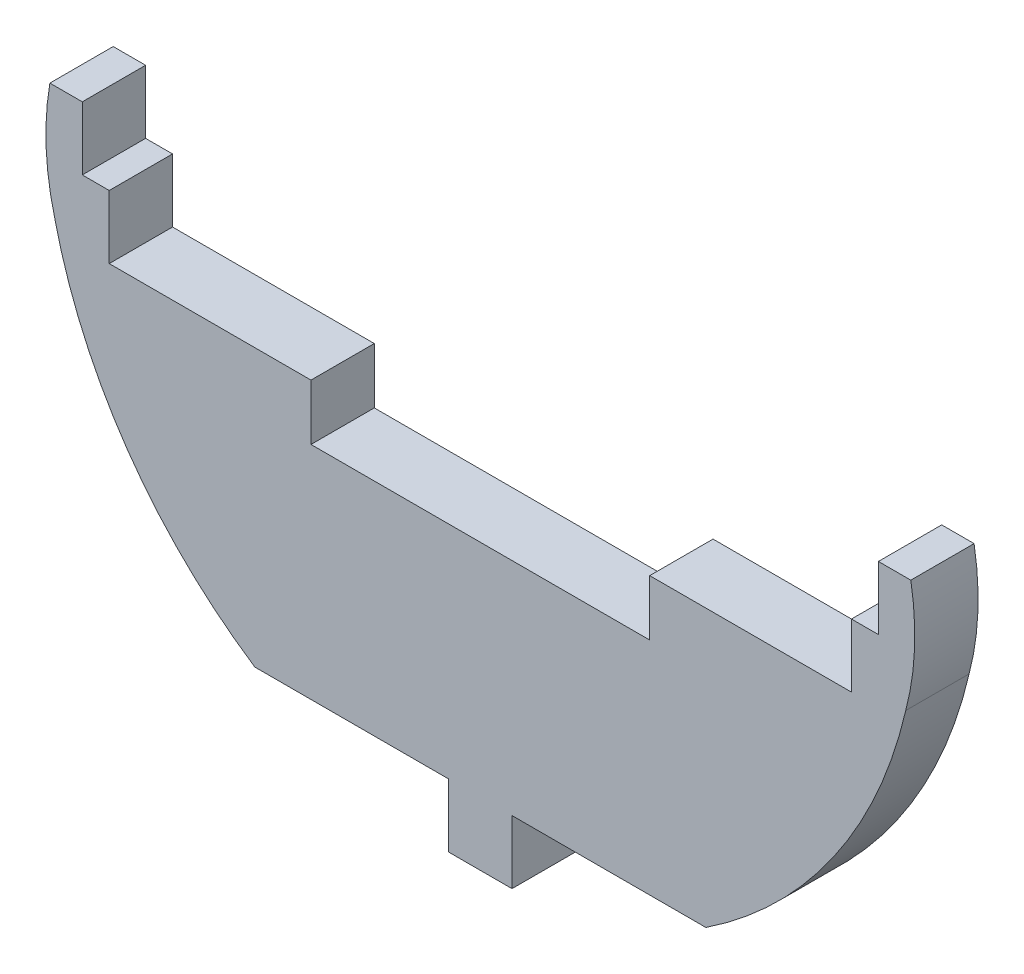
ISO-10303-21;
HEADER;
FILE_DESCRIPTION(('STEP AP214'),'2;1');
FILE_NAME('part.step','',(''),(''),'','','');
FILE_SCHEMA(('AUTOMOTIVE_DESIGN { 1 0 10303 214 1 1 1 1 }'));
ENDSEC;
DATA;
#1=APPLICATION_CONTEXT('core data for automotive mechanical design processes');
#2=APPLICATION_PROTOCOL_DEFINITION('international standard','automotive_design',2000,#1);
#3=PRODUCT_CONTEXT('',#1,'mechanical');
#4=PRODUCT('Part','Part','',(#3));
#5=PRODUCT_RELATED_PRODUCT_CATEGORY('part','',(#4));
#6=PRODUCT_DEFINITION_FORMATION('','',#4);
#7=PRODUCT_DEFINITION_CONTEXT('part definition',#1,'design');
#8=PRODUCT_DEFINITION('design','',#6,#7);
#9=PRODUCT_DEFINITION_SHAPE('','',#8);
#10=(LENGTH_UNIT() NAMED_UNIT(*) SI_UNIT(.MILLI.,.METRE.));
#11=(NAMED_UNIT(*) PLANE_ANGLE_UNIT() SI_UNIT($,.RADIAN.));
#12=(NAMED_UNIT(*) SI_UNIT($,.STERADIAN.) SOLID_ANGLE_UNIT());
#13=UNCERTAINTY_MEASURE_WITH_UNIT(LENGTH_MEASURE(1.E-05),#10,'distance_accuracy_value','');
#14=(GEOMETRIC_REPRESENTATION_CONTEXT(3) GLOBAL_UNCERTAINTY_ASSIGNED_CONTEXT((#13)) GLOBAL_UNIT_ASSIGNED_CONTEXT((#10,
#11,#12)) REPRESENTATION_CONTEXT('',''));
#15=CARTESIAN_POINT('',(0.,0.,0.));
#16=DIRECTION('',(0.,0.,1.));
#17=DIRECTION('',(1.,0.,0.));
#18=AXIS2_PLACEMENT_3D('',#15,#16,#17);
#19=CARTESIAN_POINT('',(7.81536532569599,19.9182786013469,3.));
#20=DIRECTION('',(0.,0.,-1.));
#21=DIRECTION('',(-1.,0.,0.));
#22=AXIS2_PLACEMENT_3D('',#19,#20,#21);
#23=CYLINDRICAL_SURFACE('',#22,12.768);
#24=CARTESIAN_POINT('',(7.81536532569599,19.9182786013469,0.));
#25=DIRECTION('',(0.,0.,1.));
#26=DIRECTION('',(1.,0.,0.));
#27=AXIS2_PLACEMENT_3D('',#24,#25,#26);
#28=CIRCLE('',#27,12.768);
#29=CARTESIAN_POINT('',(20.3945425277977,22.106,0.));
#30=VERTEX_POINT('',#29);
#31=CARTESIAN_POINT('',(20.154,16.635,0.));
#32=VERTEX_POINT('',#31);
#33=EDGE_CURVE('E212',#30,#32,#28,.F.);
#34=ORIENTED_EDGE('',*,*,#33,.F.);
#35=DIRECTION('',(0.,0.,-1.));
#36=VECTOR('',#35,1.);
#37=CARTESIAN_POINT('',(20.3945425277977,22.106,3.));
#38=LINE('',#37,#36);
#39=CARTESIAN_POINT('',(20.3945425277977,22.106,3.));
#40=VERTEX_POINT('',#39);
#41=EDGE_CURVE('E11',#40,#30,#38,.T.);
#42=ORIENTED_EDGE('',*,*,#41,.F.);
#43=CARTESIAN_POINT('',(7.81536532569599,19.9182786013469,3.));
#44=DIRECTION('',(0.,0.,1.));
#45=DIRECTION('',(1.,0.,0.));
#46=AXIS2_PLACEMENT_3D('',#43,#44,#45);
#47=CIRCLE('',#46,12.768);
#48=CARTESIAN_POINT('',(20.154,16.635,3.));
#49=VERTEX_POINT('',#48);
#50=EDGE_CURVE('E266',#40,#49,#47,.F.);
#51=ORIENTED_EDGE('',*,*,#50,.T.);
#52=DIRECTION('',(0.,0.,-1.));
#53=VECTOR('',#52,1.);
#54=CARTESIAN_POINT('',(20.154,16.635,3.));
#55=LINE('',#54,#53);
#56=EDGE_CURVE('E51',#49,#32,#55,.T.);
#57=ORIENTED_EDGE('',*,*,#56,.T.);
#58=EDGE_LOOP('',(#34,#42,#51,#57));
#59=FACE_BOUND('',#58,.T.);
#60=ADVANCED_FACE('F35',(#59),#23,.T.);
#61=CARTESIAN_POINT('',(0.,22.106,3.));
#62=DIRECTION('',(0.,1.,0.));
#63=DIRECTION('',(0.,0.,1.));
#64=AXIS2_PLACEMENT_3D('',#61,#62,#63);
#65=PLANE('',#64);
#66=DIRECTION('',(1.,0.,0.));
#67=VECTOR('',#66,1.);
#68=CARTESIAN_POINT('',(0.,22.106,0.));
#69=LINE('',#68,#67);
#70=CARTESIAN_POINT('',(18.859,22.106,0.));
#71=VERTEX_POINT('',#70);
#72=EDGE_CURVE('E214',#71,#30,#69,.T.);
#73=ORIENTED_EDGE('',*,*,#72,.F.);
#74=DIRECTION('',(0.,0.,-1.));
#75=VECTOR('',#74,1.);
#76=CARTESIAN_POINT('',(18.859,22.106,3.));
#77=LINE('',#76,#75);
#78=CARTESIAN_POINT('',(18.859,22.106,3.));
#79=VERTEX_POINT('',#78);
#80=EDGE_CURVE('E43',#79,#71,#77,.T.);
#81=ORIENTED_EDGE('',*,*,#80,.F.);
#82=DIRECTION('',(1.,0.,0.));
#83=VECTOR('',#82,1.);
#84=CARTESIAN_POINT('',(0.,22.106,3.));
#85=LINE('',#84,#83);
#86=EDGE_CURVE('E331',#79,#40,#85,.T.);
#87=ORIENTED_EDGE('',*,*,#86,.T.);
#88=ORIENTED_EDGE('',*,*,#41,.T.);
#89=EDGE_LOOP('',(#73,#81,#87,#88));
#90=FACE_BOUND('',#89,.T.);
#91=ADVANCED_FACE('F319',(#90),#65,.T.);
#92=CARTESIAN_POINT('',(18.859,0.,3.));
#93=DIRECTION('',(-1.,0.,0.));
#94=DIRECTION('',(0.,0.,1.));
#95=AXIS2_PLACEMENT_3D('',#92,#93,#94);
#96=PLANE('',#95);
#97=DIRECTION('',(0.,1.,0.));
#98=VECTOR('',#97,1.);
#99=CARTESIAN_POINT('',(18.859,0.,0.));
#100=LINE('',#99,#98);
#101=CARTESIAN_POINT('',(18.859,19.106,0.));
#102=VERTEX_POINT('',#101);
#103=EDGE_CURVE('E217',#102,#71,#100,.T.);
#104=ORIENTED_EDGE('',*,*,#103,.F.);
#105=DIRECTION('',(0.,0.,-1.));
#106=VECTOR('',#105,1.);
#107=CARTESIAN_POINT('',(18.859,19.106,3.));
#108=LINE('',#107,#106);
#109=CARTESIAN_POINT('',(18.859,19.106,3.));
#110=VERTEX_POINT('',#109);
#111=EDGE_CURVE('E308',#110,#102,#108,.T.);
#112=ORIENTED_EDGE('',*,*,#111,.F.);
#113=DIRECTION('',(0.,1.,0.));
#114=VECTOR('',#113,1.);
#115=CARTESIAN_POINT('',(18.859,0.,3.));
#116=LINE('',#115,#114);
#117=EDGE_CURVE('E315',#110,#79,#116,.T.);
#118=ORIENTED_EDGE('',*,*,#117,.T.);
#119=ORIENTED_EDGE('',*,*,#80,.T.);
#120=EDGE_LOOP('',(#104,#112,#118,#119));
#121=FACE_BOUND('',#120,.T.);
#122=ADVANCED_FACE('F313',(#121),#96,.T.);
#123=CARTESIAN_POINT('',(0.,19.106,3.));
#124=DIRECTION('',(0.,1.,0.));
#125=DIRECTION('',(0.,0.,1.));
#126=AXIS2_PLACEMENT_3D('',#123,#124,#125);
#127=PLANE('',#126);
#128=DIRECTION('',(1.,0.,0.));
#129=VECTOR('',#128,1.);
#130=CARTESIAN_POINT('',(0.,19.106,0.));
#131=LINE('',#130,#129);
#132=CARTESIAN_POINT('',(17.583,19.106,0.));
#133=VERTEX_POINT('',#132);
#134=EDGE_CURVE('E220',#133,#102,#131,.T.);
#135=ORIENTED_EDGE('',*,*,#134,.F.);
#136=DIRECTION('',(0.,0.,-1.));
#137=VECTOR('',#136,1.);
#138=CARTESIAN_POINT('',(17.583,19.106,3.));
#139=LINE('',#138,#137);
#140=CARTESIAN_POINT('',(17.583,19.106,3.));
#141=VERTEX_POINT('',#140);
#142=EDGE_CURVE('E306',#141,#133,#139,.T.);
#143=ORIENTED_EDGE('',*,*,#142,.F.);
#144=DIRECTION('',(1.,0.,0.));
#145=VECTOR('',#144,1.);
#146=CARTESIAN_POINT('',(0.,19.106,3.));
#147=LINE('',#146,#145);
#148=EDGE_CURVE('E328',#141,#110,#147,.T.);
#149=ORIENTED_EDGE('',*,*,#148,.T.);
#150=ORIENTED_EDGE('',*,*,#111,.T.);
#151=EDGE_LOOP('',(#135,#143,#149,#150));
#152=FACE_BOUND('',#151,.T.);
#153=ADVANCED_FACE('F325',(#152),#127,.T.);
#154=CARTESIAN_POINT('',(17.583,0.,3.));
#155=DIRECTION('',(-1.,0.,0.));
#156=DIRECTION('',(0.,0.,1.));
#157=AXIS2_PLACEMENT_3D('',#154,#155,#156);
#158=PLANE('',#157);
#159=DIRECTION('',(0.,1.,0.));
#160=VECTOR('',#159,1.);
#161=CARTESIAN_POINT('',(17.583,0.,0.));
#162=LINE('',#161,#160);
#163=CARTESIAN_POINT('',(17.583,16.106,0.));
#164=VERTEX_POINT('',#163);
#165=EDGE_CURVE('E223',#164,#133,#162,.T.);
#166=ORIENTED_EDGE('',*,*,#165,.F.);
#167=DIRECTION('',(0.,0.,-1.));
#168=VECTOR('',#167,1.);
#169=CARTESIAN_POINT('',(17.583,16.106,3.));
#170=LINE('',#169,#168);
#171=CARTESIAN_POINT('',(17.583,16.106,3.));
#172=VERTEX_POINT('',#171);
#173=EDGE_CURVE('E304',#172,#164,#170,.T.);
#174=ORIENTED_EDGE('',*,*,#173,.F.);
#175=DIRECTION('',(0.,1.,0.));
#176=VECTOR('',#175,1.);
#177=CARTESIAN_POINT('',(17.583,0.,3.));
#178=LINE('',#177,#176);
#179=EDGE_CURVE('E333',#172,#141,#178,.T.);
#180=ORIENTED_EDGE('',*,*,#179,.T.);
#181=ORIENTED_EDGE('',*,*,#142,.T.);
#182=EDGE_LOOP('',(#166,#174,#180,#181));
#183=FACE_BOUND('',#182,.T.);
#184=ADVANCED_FACE('F393',(#183),#158,.T.);
#185=CARTESIAN_POINT('',(0.,16.106,3.));
#186=DIRECTION('',(0.,1.,0.));
#187=DIRECTION('',(0.,0.,1.));
#188=AXIS2_PLACEMENT_3D('',#185,#186,#187);
#189=PLANE('',#188);
#190=DIRECTION('',(1.,0.,0.));
#191=VECTOR('',#190,1.);
#192=CARTESIAN_POINT('',(0.,16.106,0.));
#193=LINE('',#192,#191);
#194=CARTESIAN_POINT('',(8.024,16.106,0.));
#195=VERTEX_POINT('',#194);
#196=EDGE_CURVE('E226',#195,#164,#193,.T.);
#197=ORIENTED_EDGE('',*,*,#196,.F.);
#198=DIRECTION('',(0.,0.,-1.));
#199=VECTOR('',#198,1.);
#200=CARTESIAN_POINT('',(8.024,16.106,3.));
#201=LINE('',#200,#199);
#202=CARTESIAN_POINT('',(8.024,16.106,3.));
#203=VERTEX_POINT('',#202);
#204=EDGE_CURVE('E302',#203,#195,#201,.T.);
#205=ORIENTED_EDGE('',*,*,#204,.F.);
#206=DIRECTION('',(1.,0.,0.));
#207=VECTOR('',#206,1.);
#208=CARTESIAN_POINT('',(0.,16.106,3.));
#209=LINE('',#208,#207);
#210=EDGE_CURVE('E339',#203,#172,#209,.T.);
#211=ORIENTED_EDGE('',*,*,#210,.T.);
#212=ORIENTED_EDGE('',*,*,#173,.T.);
#213=EDGE_LOOP('',(#197,#205,#211,#212));
#214=FACE_BOUND('',#213,.T.);
#215=ADVANCED_FACE('F396',(#214),#189,.T.);
#216=CARTESIAN_POINT('',(8.024,0.,3.));
#217=DIRECTION('',(-1.,0.,0.));
#218=DIRECTION('',(0.,0.,1.));
#219=AXIS2_PLACEMENT_3D('',#216,#217,#218);
#220=PLANE('',#219);
#221=DIRECTION('',(0.,1.,0.));
#222=VECTOR('',#221,1.);
#223=CARTESIAN_POINT('',(8.024,0.,0.));
#224=LINE('',#223,#222);
#225=CARTESIAN_POINT('',(8.024,13.464,0.));
#226=VERTEX_POINT('',#225);
#227=EDGE_CURVE('E229',#226,#195,#224,.T.);
#228=ORIENTED_EDGE('',*,*,#227,.F.);
#229=DIRECTION('',(0.,0.,-1.));
#230=VECTOR('',#229,1.);
#231=CARTESIAN_POINT('',(8.024,13.464,3.));
#232=LINE('',#231,#230);
#233=CARTESIAN_POINT('',(8.024,13.464,3.));
#234=VERTEX_POINT('',#233);
#235=EDGE_CURVE('E300',#234,#226,#232,.T.);
#236=ORIENTED_EDGE('',*,*,#235,.F.);
#237=DIRECTION('',(0.,1.,0.));
#238=VECTOR('',#237,1.);
#239=CARTESIAN_POINT('',(8.024,0.,3.));
#240=LINE('',#239,#238);
#241=EDGE_CURVE('E342',#234,#203,#240,.T.);
#242=ORIENTED_EDGE('',*,*,#241,.T.);
#243=ORIENTED_EDGE('',*,*,#204,.T.);
#244=EDGE_LOOP('',(#228,#236,#242,#243));
#245=FACE_BOUND('',#244,.T.);
#246=ADVANCED_FACE('F400',(#245),#220,.T.);
#247=CARTESIAN_POINT('',(0.,13.464,3.));
#248=DIRECTION('',(0.,-1.,0.));
#249=DIRECTION('',(0.,0.,-1.));
#250=AXIS2_PLACEMENT_3D('',#247,#248,#249);
#251=PLANE('',#250);
#252=DIRECTION('',(-1.,0.,0.));
#253=VECTOR('',#252,1.);
#254=CARTESIAN_POINT('',(0.,13.464,0.));
#255=LINE('',#254,#253);
#256=CARTESIAN_POINT('',(-8.024,13.464,0.));
#257=VERTEX_POINT('',#256);
#258=EDGE_CURVE('E232',#226,#257,#255,.T.);
#259=ORIENTED_EDGE('',*,*,#258,.T.);
#260=DIRECTION('',(0.,0.,-1.));
#261=VECTOR('',#260,1.);
#262=CARTESIAN_POINT('',(-8.024,13.464,3.));
#263=LINE('',#262,#261);
#264=CARTESIAN_POINT('',(-8.024,13.464,3.));
#265=VERTEX_POINT('',#264);
#266=EDGE_CURVE('E297',#265,#257,#263,.T.);
#267=ORIENTED_EDGE('',*,*,#266,.F.);
#268=DIRECTION('',(-1.,0.,0.));
#269=VECTOR('',#268,1.);
#270=CARTESIAN_POINT('',(0.,13.464,3.));
#271=LINE('',#270,#269);
#272=EDGE_CURVE('E345',#234,#265,#271,.T.);
#273=ORIENTED_EDGE('',*,*,#272,.F.);
#274=ORIENTED_EDGE('',*,*,#235,.T.);
#275=EDGE_LOOP('',(#259,#267,#273,#274));
#276=FACE_BOUND('',#275,.T.);
#277=ADVANCED_FACE('F404',(#276),#251,.F.);
#278=CARTESIAN_POINT('',(-8.024,0.,3.));
#279=DIRECTION('',(-1.,0.,0.));
#280=DIRECTION('',(0.,0.,1.));
#281=AXIS2_PLACEMENT_3D('',#278,#279,#280);
#282=PLANE('',#281);
#283=DIRECTION('',(0.,1.,0.));
#284=VECTOR('',#283,1.);
#285=CARTESIAN_POINT('',(-8.024,0.,0.));
#286=LINE('',#285,#284);
#287=CARTESIAN_POINT('',(-8.024,16.106,0.));
#288=VERTEX_POINT('',#287);
#289=EDGE_CURVE('E234',#257,#288,#286,.T.);
#290=ORIENTED_EDGE('',*,*,#289,.T.);
#291=DIRECTION('',(0.,0.,-1.));
#292=VECTOR('',#291,1.);
#293=CARTESIAN_POINT('',(-8.024,16.106,3.));
#294=LINE('',#293,#292);
#295=CARTESIAN_POINT('',(-8.024,16.106,3.));
#296=VERTEX_POINT('',#295);
#297=EDGE_CURVE('E294',#296,#288,#294,.T.);
#298=ORIENTED_EDGE('',*,*,#297,.F.);
#299=DIRECTION('',(0.,1.,0.));
#300=VECTOR('',#299,1.);
#301=CARTESIAN_POINT('',(-8.024,0.,3.));
#302=LINE('',#301,#300);
#303=EDGE_CURVE('E347',#265,#296,#302,.T.);
#304=ORIENTED_EDGE('',*,*,#303,.F.);
#305=ORIENTED_EDGE('',*,*,#266,.T.);
#306=EDGE_LOOP('',(#290,#298,#304,#305));
#307=FACE_BOUND('',#306,.T.);
#308=ADVANCED_FACE('F408',(#307),#282,.F.);
#309=CARTESIAN_POINT('',(0.,16.106,3.));
#310=DIRECTION('',(0.,-1.,0.));
#311=DIRECTION('',(0.,0.,-1.));
#312=AXIS2_PLACEMENT_3D('',#309,#310,#311);
#313=PLANE('',#312);
#314=DIRECTION('',(-1.,0.,0.));
#315=VECTOR('',#314,1.);
#316=CARTESIAN_POINT('',(0.,16.106,0.));
#317=LINE('',#316,#315);
#318=CARTESIAN_POINT('',(-17.583,16.106,0.));
#319=VERTEX_POINT('',#318);
#320=EDGE_CURVE('E236',#288,#319,#317,.T.);
#321=ORIENTED_EDGE('',*,*,#320,.T.);
#322=DIRECTION('',(0.,0.,-1.));
#323=VECTOR('',#322,1.);
#324=CARTESIAN_POINT('',(-17.583,16.106,3.));
#325=LINE('',#324,#323);
#326=CARTESIAN_POINT('',(-17.583,16.106,3.));
#327=VERTEX_POINT('',#326);
#328=EDGE_CURVE('E291',#327,#319,#325,.T.);
#329=ORIENTED_EDGE('',*,*,#328,.F.);
#330=DIRECTION('',(-1.,0.,0.));
#331=VECTOR('',#330,1.);
#332=CARTESIAN_POINT('',(0.,16.106,3.));
#333=LINE('',#332,#331);
#334=EDGE_CURVE('E349',#296,#327,#333,.T.);
#335=ORIENTED_EDGE('',*,*,#334,.F.);
#336=ORIENTED_EDGE('',*,*,#297,.T.);
#337=EDGE_LOOP('',(#321,#329,#335,#336));
#338=FACE_BOUND('',#337,.T.);
#339=ADVANCED_FACE('F412',(#338),#313,.F.);
#340=CARTESIAN_POINT('',(-17.583,0.,3.));
#341=DIRECTION('',(-1.,0.,0.));
#342=DIRECTION('',(0.,0.,1.));
#343=AXIS2_PLACEMENT_3D('',#340,#341,#342);
#344=PLANE('',#343);
#345=DIRECTION('',(0.,1.,0.));
#346=VECTOR('',#345,1.);
#347=CARTESIAN_POINT('',(-17.583,0.,0.));
#348=LINE('',#347,#346);
#349=CARTESIAN_POINT('',(-17.583,19.106,0.));
#350=VERTEX_POINT('',#349);
#351=EDGE_CURVE('E238',#319,#350,#348,.T.);
#352=ORIENTED_EDGE('',*,*,#351,.T.);
#353=DIRECTION('',(0.,0.,-1.));
#354=VECTOR('',#353,1.);
#355=CARTESIAN_POINT('',(-17.583,19.106,3.));
#356=LINE('',#355,#354);
#357=CARTESIAN_POINT('',(-17.583,19.106,3.));
#358=VERTEX_POINT('',#357);
#359=EDGE_CURVE('E288',#358,#350,#356,.T.);
#360=ORIENTED_EDGE('',*,*,#359,.F.);
#361=DIRECTION('',(0.,1.,0.));
#362=VECTOR('',#361,1.);
#363=CARTESIAN_POINT('',(-17.583,0.,3.));
#364=LINE('',#363,#362);
#365=EDGE_CURVE('E351',#327,#358,#364,.T.);
#366=ORIENTED_EDGE('',*,*,#365,.F.);
#367=ORIENTED_EDGE('',*,*,#328,.T.);
#368=EDGE_LOOP('',(#352,#360,#366,#367));
#369=FACE_BOUND('',#368,.T.);
#370=ADVANCED_FACE('F416',(#369),#344,.F.);
#371=CARTESIAN_POINT('',(0.,19.106,3.));
#372=DIRECTION('',(0.,-1.,0.));
#373=DIRECTION('',(0.,0.,-1.));
#374=AXIS2_PLACEMENT_3D('',#371,#372,#373);
#375=PLANE('',#374);
#376=DIRECTION('',(-1.,0.,0.));
#377=VECTOR('',#376,1.);
#378=CARTESIAN_POINT('',(0.,19.106,0.));
#379=LINE('',#378,#377);
#380=CARTESIAN_POINT('',(-18.859,19.106,0.));
#381=VERTEX_POINT('',#380);
#382=EDGE_CURVE('E240',#350,#381,#379,.T.);
#383=ORIENTED_EDGE('',*,*,#382,.T.);
#384=DIRECTION('',(0.,0.,-1.));
#385=VECTOR('',#384,1.);
#386=CARTESIAN_POINT('',(-18.859,19.106,3.));
#387=LINE('',#386,#385);
#388=CARTESIAN_POINT('',(-18.859,19.106,3.));
#389=VERTEX_POINT('',#388);
#390=EDGE_CURVE('E285',#389,#381,#387,.T.);
#391=ORIENTED_EDGE('',*,*,#390,.F.);
#392=DIRECTION('',(-1.,0.,0.));
#393=VECTOR('',#392,1.);
#394=CARTESIAN_POINT('',(0.,19.106,3.));
#395=LINE('',#394,#393);
#396=EDGE_CURVE('E353',#358,#389,#395,.T.);
#397=ORIENTED_EDGE('',*,*,#396,.F.);
#398=ORIENTED_EDGE('',*,*,#359,.T.);
#399=EDGE_LOOP('',(#383,#391,#397,#398));
#400=FACE_BOUND('',#399,.T.);
#401=ADVANCED_FACE('F420',(#400),#375,.F.);
#402=CARTESIAN_POINT('',(-18.859,0.,3.));
#403=DIRECTION('',(-1.,0.,0.));
#404=DIRECTION('',(0.,0.,1.));
#405=AXIS2_PLACEMENT_3D('',#402,#403,#404);
#406=PLANE('',#405);
#407=DIRECTION('',(0.,1.,0.));
#408=VECTOR('',#407,1.);
#409=CARTESIAN_POINT('',(-18.859,0.,0.));
#410=LINE('',#409,#408);
#411=CARTESIAN_POINT('',(-18.859,22.106,0.));
#412=VERTEX_POINT('',#411);
#413=EDGE_CURVE('E242',#381,#412,#410,.T.);
#414=ORIENTED_EDGE('',*,*,#413,.T.);
#415=DIRECTION('',(0.,0.,-1.));
#416=VECTOR('',#415,1.);
#417=CARTESIAN_POINT('',(-18.859,22.106,3.));
#418=LINE('',#417,#416);
#419=CARTESIAN_POINT('',(-18.859,22.106,3.));
#420=VERTEX_POINT('',#419);
#421=EDGE_CURVE('E282',#420,#412,#418,.T.);
#422=ORIENTED_EDGE('',*,*,#421,.F.);
#423=DIRECTION('',(0.,1.,0.));
#424=VECTOR('',#423,1.);
#425=CARTESIAN_POINT('',(-18.859,0.,3.));
#426=LINE('',#425,#424);
#427=EDGE_CURVE('E355',#389,#420,#426,.T.);
#428=ORIENTED_EDGE('',*,*,#427,.F.);
#429=ORIENTED_EDGE('',*,*,#390,.T.);
#430=EDGE_LOOP('',(#414,#422,#428,#429));
#431=FACE_BOUND('',#430,.T.);
#432=ADVANCED_FACE('F424',(#431),#406,.F.);
#433=CARTESIAN_POINT('',(0.,22.106,3.));
#434=DIRECTION('',(0.,-1.,0.));
#435=DIRECTION('',(0.,0.,-1.));
#436=AXIS2_PLACEMENT_3D('',#433,#434,#435);
#437=PLANE('',#436);
#438=DIRECTION('',(-1.,0.,0.));
#439=VECTOR('',#438,1.);
#440=CARTESIAN_POINT('',(0.,22.106,0.));
#441=LINE('',#440,#439);
#442=CARTESIAN_POINT('',(-20.3945425277977,22.106,0.));
#443=VERTEX_POINT('',#442);
#444=EDGE_CURVE('E244',#412,#443,#441,.T.);
#445=ORIENTED_EDGE('',*,*,#444,.T.);
#446=DIRECTION('',(0.,0.,-1.));
#447=VECTOR('',#446,1.);
#448=CARTESIAN_POINT('',(-20.3945425277977,22.106,3.));
#449=LINE('',#448,#447);
#450=CARTESIAN_POINT('',(-20.3945425277977,22.106,3.));
#451=VERTEX_POINT('',#450);
#452=EDGE_CURVE('E279',#451,#443,#449,.T.);
#453=ORIENTED_EDGE('',*,*,#452,.F.);
#454=DIRECTION('',(-1.,0.,0.));
#455=VECTOR('',#454,1.);
#456=CARTESIAN_POINT('',(0.,22.106,3.));
#457=LINE('',#456,#455);
#458=EDGE_CURVE('E357',#420,#451,#457,.T.);
#459=ORIENTED_EDGE('',*,*,#458,.F.);
#460=ORIENTED_EDGE('',*,*,#421,.T.);
#461=EDGE_LOOP('',(#445,#453,#459,#460));
#462=FACE_BOUND('',#461,.T.);
#463=ADVANCED_FACE('F428',(#462),#437,.F.);
#464=CARTESIAN_POINT('',(-7.81536532569599,19.9182786013469,3.));
#465=DIRECTION('',(0.,0.,-1.));
#466=DIRECTION('',(-1.,0.,0.));
#467=AXIS2_PLACEMENT_3D('',#464,#465,#466);
#468=CYLINDRICAL_SURFACE('',#467,12.768);
#469=CARTESIAN_POINT('',(-7.81536532569599,19.9182786013469,0.));
#470=DIRECTION('',(0.,0.,1.));
#471=DIRECTION('',(1.,0.,0.));
#472=AXIS2_PLACEMENT_3D('',#469,#470,#471);
#473=CIRCLE('',#472,12.768);
#474=CARTESIAN_POINT('',(-20.154,16.635,0.));
#475=VERTEX_POINT('',#474);
#476=EDGE_CURVE('E246',#443,#475,#473,.T.);
#477=ORIENTED_EDGE('',*,*,#476,.T.);
#478=DIRECTION('',(0.,0.,-1.));
#479=VECTOR('',#478,1.);
#480=CARTESIAN_POINT('',(-20.154,16.635,3.));
#481=LINE('',#480,#479);
#482=CARTESIAN_POINT('',(-20.154,16.635,3.));
#483=VERTEX_POINT('',#482);
#484=EDGE_CURVE('E276',#483,#475,#481,.T.);
#485=ORIENTED_EDGE('',*,*,#484,.F.);
#486=CARTESIAN_POINT('',(-7.81536532569599,19.9182786013469,3.));
#487=DIRECTION('',(0.,0.,1.));
#488=DIRECTION('',(1.,0.,0.));
#489=AXIS2_PLACEMENT_3D('',#486,#487,#488);
#490=CIRCLE('',#489,12.768);
#491=EDGE_CURVE('E359',#451,#483,#490,.T.);
#492=ORIENTED_EDGE('',*,*,#491,.F.);
#493=ORIENTED_EDGE('',*,*,#452,.T.);
#494=EDGE_LOOP('',(#477,#485,#492,#493));
#495=FACE_BOUND('',#494,.T.);
#496=ADVANCED_FACE('F432',(#495),#468,.T.);
#497=CARTESIAN_POINT('',(1.6938911337794,21.7030210148068,3.));
#498=DIRECTION('',(0.,0.,-1.));
#499=DIRECTION('',(-1.,0.,0.));
#500=AXIS2_PLACEMENT_3D('',#497,#498,#499);
#501=CYLINDRICAL_SURFACE('',#500,22.428);
#502=CARTESIAN_POINT('',(1.6938911337794,21.7030210148068,0.));
#503=DIRECTION('',(0.,0.,1.));
#504=DIRECTION('',(1.,0.,0.));
#505=AXIS2_PLACEMENT_3D('',#502,#503,#504);
#506=CIRCLE('',#505,22.428);
#507=CARTESIAN_POINT('',(-10.684,3.,0.));
#508=VERTEX_POINT('',#507);
#509=EDGE_CURVE('E248',#475,#508,#506,.T.);
#510=ORIENTED_EDGE('',*,*,#509,.T.);
#511=DIRECTION('',(0.,0.,-1.));
#512=VECTOR('',#511,1.);
#513=CARTESIAN_POINT('',(-10.684,3.,3.));
#514=LINE('',#513,#512);
#515=CARTESIAN_POINT('',(-10.684,3.,3.));
#516=VERTEX_POINT('',#515);
#517=EDGE_CURVE('E274',#516,#508,#514,.T.);
#518=ORIENTED_EDGE('',*,*,#517,.F.);
#519=CARTESIAN_POINT('',(1.6938911337794,21.7030210148068,3.));
#520=DIRECTION('',(0.,0.,1.));
#521=DIRECTION('',(1.,0.,0.));
#522=AXIS2_PLACEMENT_3D('',#519,#520,#521);
#523=CIRCLE('',#522,22.428);
#524=EDGE_CURVE('E361',#483,#516,#523,.T.);
#525=ORIENTED_EDGE('',*,*,#524,.F.);
#526=ORIENTED_EDGE('',*,*,#484,.T.);
#527=EDGE_LOOP('',(#510,#518,#525,#526));
#528=FACE_BOUND('',#527,.T.);
#529=ADVANCED_FACE('F436',(#528),#501,.T.);
#530=CARTESIAN_POINT('',(0.,3.,3.));
#531=DIRECTION('',(0.,-1.,0.));
#532=DIRECTION('',(1.,0.,0.));
#533=AXIS2_PLACEMENT_3D('',#530,#531,#532);
#534=PLANE('',#533);
#535=DIRECTION('',(-1.,0.,0.));
#536=VECTOR('',#535,1.);
#537=CARTESIAN_POINT('',(0.,3.,0.));
#538=LINE('',#537,#536);
#539=CARTESIAN_POINT('',(-1.5,3.,0.));
#540=VERTEX_POINT('',#539);
#541=EDGE_CURVE('E251',#540,#508,#538,.T.);
#542=ORIENTED_EDGE('',*,*,#541,.F.);
#543=DIRECTION('',(0.,0.,-1.));
#544=VECTOR('',#543,1.);
#545=CARTESIAN_POINT('',(-1.5,3.,3.));
#546=LINE('',#545,#544);
#547=CARTESIAN_POINT('',(-1.5,3.,3.));
#548=VERTEX_POINT('',#547);
#549=EDGE_CURVE('E272',#548,#540,#546,.T.);
#550=ORIENTED_EDGE('',*,*,#549,.F.);
#551=DIRECTION('',(-1.,0.,0.));
#552=VECTOR('',#551,1.);
#553=CARTESIAN_POINT('',(0.,3.,3.));
#554=LINE('',#553,#552);
#555=EDGE_CURVE('E363',#548,#516,#554,.T.);
#556=ORIENTED_EDGE('',*,*,#555,.T.);
#557=ORIENTED_EDGE('',*,*,#517,.T.);
#558=EDGE_LOOP('',(#542,#550,#556,#557));
#559=FACE_BOUND('',#558,.T.);
#560=ADVANCED_FACE('F440',(#559),#534,.T.);
#561=CARTESIAN_POINT('',(-1.5,0.,3.));
#562=DIRECTION('',(-1.,0.,0.));
#563=DIRECTION('',(0.,0.,1.));
#564=AXIS2_PLACEMENT_3D('',#561,#562,#563);
#565=PLANE('',#564);
#566=DIRECTION('',(0.,1.,0.));
#567=VECTOR('',#566,1.);
#568=CARTESIAN_POINT('',(-1.5,0.,0.));
#569=LINE('',#568,#567);
#570=CARTESIAN_POINT('',(-1.5,0.,0.));
#571=VERTEX_POINT('',#570);
#572=EDGE_CURVE('E254',#571,#540,#569,.T.);
#573=ORIENTED_EDGE('',*,*,#572,.F.);
#574=DIRECTION('',(0.,0.,-1.));
#575=VECTOR('',#574,1.);
#576=CARTESIAN_POINT('',(-1.5,0.,3.));
#577=LINE('',#576,#575);
#578=CARTESIAN_POINT('',(-1.5,0.,3.));
#579=VERTEX_POINT('',#578);
#580=EDGE_CURVE('E270',#579,#571,#577,.T.);
#581=ORIENTED_EDGE('',*,*,#580,.F.);
#582=DIRECTION('',(0.,1.,0.));
#583=VECTOR('',#582,1.);
#584=CARTESIAN_POINT('',(-1.5,0.,3.));
#585=LINE('',#584,#583);
#586=EDGE_CURVE('E366',#579,#548,#585,.T.);
#587=ORIENTED_EDGE('',*,*,#586,.T.);
#588=ORIENTED_EDGE('',*,*,#549,.T.);
#589=EDGE_LOOP('',(#573,#581,#587,#588));
#590=FACE_BOUND('',#589,.T.);
#591=ADVANCED_FACE('F444',(#590),#565,.T.);
#592=CARTESIAN_POINT('',(0.,0.,3.));
#593=DIRECTION('',(0.,-1.,0.));
#594=DIRECTION('',(0.,0.,-1.));
#595=AXIS2_PLACEMENT_3D('',#592,#593,#594);
#596=PLANE('',#595);
#597=DIRECTION('',(-1.,0.,0.));
#598=VECTOR('',#597,1.);
#599=CARTESIAN_POINT('',(0.,0.,0.));
#600=LINE('',#599,#598);
#601=CARTESIAN_POINT('',(1.5,0.,0.));
#602=VERTEX_POINT('',#601);
#603=EDGE_CURVE('E257',#602,#571,#600,.T.);
#604=ORIENTED_EDGE('',*,*,#603,.F.);
#605=DIRECTION('',(0.,0.,-1.));
#606=VECTOR('',#605,1.);
#607=CARTESIAN_POINT('',(1.5,0.,3.));
#608=LINE('',#607,#606);
#609=CARTESIAN_POINT('',(1.5,0.,3.));
#610=VERTEX_POINT('',#609);
#611=EDGE_CURVE('E204',#610,#602,#608,.T.);
#612=ORIENTED_EDGE('',*,*,#611,.F.);
#613=DIRECTION('',(-1.,0.,0.));
#614=VECTOR('',#613,1.);
#615=CARTESIAN_POINT('',(0.,0.,3.));
#616=LINE('',#615,#614);
#617=EDGE_CURVE('E194',#610,#579,#616,.T.);
#618=ORIENTED_EDGE('',*,*,#617,.T.);
#619=ORIENTED_EDGE('',*,*,#580,.T.);
#620=EDGE_LOOP('',(#604,#612,#618,#619));
#621=FACE_BOUND('',#620,.T.);
#622=ADVANCED_FACE('F370',(#621),#596,.T.);
#623=CARTESIAN_POINT('',(1.5,0.,3.));
#624=DIRECTION('',(-1.,0.,0.));
#625=DIRECTION('',(0.,0.,1.));
#626=AXIS2_PLACEMENT_3D('',#623,#624,#625);
#627=PLANE('',#626);
#628=DIRECTION('',(0.,1.,0.));
#629=VECTOR('',#628,1.);
#630=CARTESIAN_POINT('',(1.5,0.,0.));
#631=LINE('',#630,#629);
#632=CARTESIAN_POINT('',(1.5,3.,0.));
#633=VERTEX_POINT('',#632);
#634=EDGE_CURVE('E201',#602,#633,#631,.T.);
#635=ORIENTED_EDGE('',*,*,#634,.T.);
#636=DIRECTION('',(0.,0.,-1.));
#637=VECTOR('',#636,1.);
#638=CARTESIAN_POINT('',(1.5,3.,3.));
#639=LINE('',#638,#637);
#640=CARTESIAN_POINT('',(1.5,3.,3.));
#641=VERTEX_POINT('',#640);
#642=EDGE_CURVE('E198',#641,#633,#639,.T.);
#643=ORIENTED_EDGE('',*,*,#642,.F.);
#644=DIRECTION('',(0.,1.,0.));
#645=VECTOR('',#644,1.);
#646=CARTESIAN_POINT('',(1.5,0.,3.));
#647=LINE('',#646,#645);
#648=EDGE_CURVE('E186',#610,#641,#647,.T.);
#649=ORIENTED_EDGE('',*,*,#648,.F.);
#650=ORIENTED_EDGE('',*,*,#611,.T.);
#651=EDGE_LOOP('',(#635,#643,#649,#650));
#652=FACE_BOUND('',#651,.T.);
#653=ADVANCED_FACE('F199',(#652),#627,.F.);
#654=CARTESIAN_POINT('',(0.,3.,3.));
#655=DIRECTION('',(0.,1.,0.));
#656=DIRECTION('',(-1.,0.,0.));
#657=AXIS2_PLACEMENT_3D('',#654,#655,#656);
#658=PLANE('',#657);
#659=DIRECTION('',(1.,0.,0.));
#660=VECTOR('',#659,1.);
#661=CARTESIAN_POINT('',(0.,3.,0.));
#662=LINE('',#661,#660);
#663=CARTESIAN_POINT('',(10.684,3.,0.));
#664=VERTEX_POINT('',#663);
#665=EDGE_CURVE('E261',#633,#664,#662,.T.);
#666=ORIENTED_EDGE('',*,*,#665,.T.);
#667=DIRECTION('',(0.,0.,-1.));
#668=VECTOR('',#667,1.);
#669=CARTESIAN_POINT('',(10.684,3.,3.));
#670=LINE('',#669,#668);
#671=CARTESIAN_POINT('',(10.684,3.,3.));
#672=VERTEX_POINT('',#671);
#673=EDGE_CURVE('E119',#672,#664,#670,.T.);
#674=ORIENTED_EDGE('',*,*,#673,.F.);
#675=DIRECTION('',(1.,0.,0.));
#676=VECTOR('',#675,1.);
#677=CARTESIAN_POINT('',(0.,3.,3.));
#678=LINE('',#677,#676);
#679=EDGE_CURVE('E191',#641,#672,#678,.T.);
#680=ORIENTED_EDGE('',*,*,#679,.F.);
#681=ORIENTED_EDGE('',*,*,#642,.T.);
#682=EDGE_LOOP('',(#666,#674,#680,#681));
#683=FACE_BOUND('',#682,.T.);
#684=ADVANCED_FACE('F206',(#683),#658,.F.);
#685=CARTESIAN_POINT('',(-1.6938911337794,21.7030210148068,3.));
#686=DIRECTION('',(0.,0.,-1.));
#687=DIRECTION('',(-1.,0.,0.));
#688=AXIS2_PLACEMENT_3D('',#685,#686,#687);
#689=CYLINDRICAL_SURFACE('',#688,22.428);
#690=CARTESIAN_POINT('',(-1.6938911337794,21.7030210148068,0.));
#691=DIRECTION('',(0.,0.,1.));
#692=DIRECTION('',(1.,0.,0.));
#693=AXIS2_PLACEMENT_3D('',#690,#691,#692);
#694=CIRCLE('',#693,22.428);
#695=EDGE_CURVE('E263',#32,#664,#694,.F.);
#696=ORIENTED_EDGE('',*,*,#695,.F.);
#697=ORIENTED_EDGE('',*,*,#56,.F.);
#698=CARTESIAN_POINT('',(-1.6938911337794,21.7030210148068,3.));
#699=DIRECTION('',(0.,0.,1.));
#700=DIRECTION('',(1.,0.,0.));
#701=AXIS2_PLACEMENT_3D('',#698,#699,#700);
#702=CIRCLE('',#701,22.428);
#703=EDGE_CURVE('E207',#49,#672,#702,.F.);
#704=ORIENTED_EDGE('',*,*,#703,.T.);
#705=ORIENTED_EDGE('',*,*,#673,.T.);
#706=EDGE_LOOP('',(#696,#697,#704,#705));
#707=FACE_BOUND('',#706,.T.);
#708=ADVANCED_FACE('F372',(#707),#689,.T.);
#709=CARTESIAN_POINT('',(0.,0.,3.));
#710=DIRECTION('',(0.,0.,1.));
#711=DIRECTION('',(1.,0.,0.));
#712=AXIS2_PLACEMENT_3D('',#709,#710,#711);
#713=PLANE('',#712);
#714=ORIENTED_EDGE('',*,*,#50,.F.);
#715=ORIENTED_EDGE('',*,*,#86,.F.);
#716=ORIENTED_EDGE('',*,*,#117,.F.);
#717=ORIENTED_EDGE('',*,*,#148,.F.);
#718=ORIENTED_EDGE('',*,*,#179,.F.);
#719=ORIENTED_EDGE('',*,*,#210,.F.);
#720=ORIENTED_EDGE('',*,*,#241,.F.);
#721=ORIENTED_EDGE('',*,*,#272,.T.);
#722=ORIENTED_EDGE('',*,*,#303,.T.);
#723=ORIENTED_EDGE('',*,*,#334,.T.);
#724=ORIENTED_EDGE('',*,*,#365,.T.);
#725=ORIENTED_EDGE('',*,*,#396,.T.);
#726=ORIENTED_EDGE('',*,*,#427,.T.);
#727=ORIENTED_EDGE('',*,*,#458,.T.);
#728=ORIENTED_EDGE('',*,*,#491,.T.);
#729=ORIENTED_EDGE('',*,*,#524,.T.);
#730=ORIENTED_EDGE('',*,*,#555,.F.);
#731=ORIENTED_EDGE('',*,*,#586,.F.);
#732=ORIENTED_EDGE('',*,*,#617,.F.);
#733=ORIENTED_EDGE('',*,*,#648,.T.);
#734=ORIENTED_EDGE('',*,*,#679,.T.);
#735=ORIENTED_EDGE('',*,*,#703,.F.);
#736=EDGE_LOOP('',(#714,#715,#716,#717,#718,#719,#720,#721,#722,#723,#724,#725,#726,#727,#728,
#729,#730,#731,#732,#733,#734,#735));
#737=FACE_BOUND('',#736,.T.);
#738=ADVANCED_FACE('F188',(#737),#713,.T.);
#739=CARTESIAN_POINT('',(0.,0.,0.));
#740=DIRECTION('',(0.,0.,1.));
#741=DIRECTION('',(1.,0.,0.));
#742=AXIS2_PLACEMENT_3D('',#739,#740,#741);
#743=PLANE('',#742);
#744=ORIENTED_EDGE('',*,*,#33,.T.);
#745=ORIENTED_EDGE('',*,*,#695,.T.);
#746=ORIENTED_EDGE('',*,*,#665,.F.);
#747=ORIENTED_EDGE('',*,*,#634,.F.);
#748=ORIENTED_EDGE('',*,*,#603,.T.);
#749=ORIENTED_EDGE('',*,*,#572,.T.);
#750=ORIENTED_EDGE('',*,*,#541,.T.);
#751=ORIENTED_EDGE('',*,*,#509,.F.);
#752=ORIENTED_EDGE('',*,*,#476,.F.);
#753=ORIENTED_EDGE('',*,*,#444,.F.);
#754=ORIENTED_EDGE('',*,*,#413,.F.);
#755=ORIENTED_EDGE('',*,*,#382,.F.);
#756=ORIENTED_EDGE('',*,*,#351,.F.);
#757=ORIENTED_EDGE('',*,*,#320,.F.);
#758=ORIENTED_EDGE('',*,*,#289,.F.);
#759=ORIENTED_EDGE('',*,*,#258,.F.);
#760=ORIENTED_EDGE('',*,*,#227,.T.);
#761=ORIENTED_EDGE('',*,*,#196,.T.);
#762=ORIENTED_EDGE('',*,*,#165,.T.);
#763=ORIENTED_EDGE('',*,*,#134,.T.);
#764=ORIENTED_EDGE('',*,*,#103,.T.);
#765=ORIENTED_EDGE('',*,*,#72,.T.);
#766=EDGE_LOOP('',(#744,#745,#746,#747,#748,#749,#750,#751,#752,#753,#754,#755,#756,#757,#758,
#759,#760,#761,#762,#763,#764,#765));
#767=FACE_BOUND('',#766,.T.);
#768=ADVANCED_FACE('F321',(#767),#743,.F.);
#769=CLOSED_SHELL('',(#60,#91,#122,#153,#184,#215,#246,#277,#308,#339,#370,#401,#432,#463,#496,
#529,#560,#591,#622,#653,#684,#708,#738,#768));
#770=MANIFOLD_SOLID_BREP('B2',#769);
#771=ADVANCED_BREP_SHAPE_REPRESENTATION('',(#18,#770),#14);
#772=SHAPE_DEFINITION_REPRESENTATION(#9,#771);
ENDSEC;
END-ISO-10303-21;
